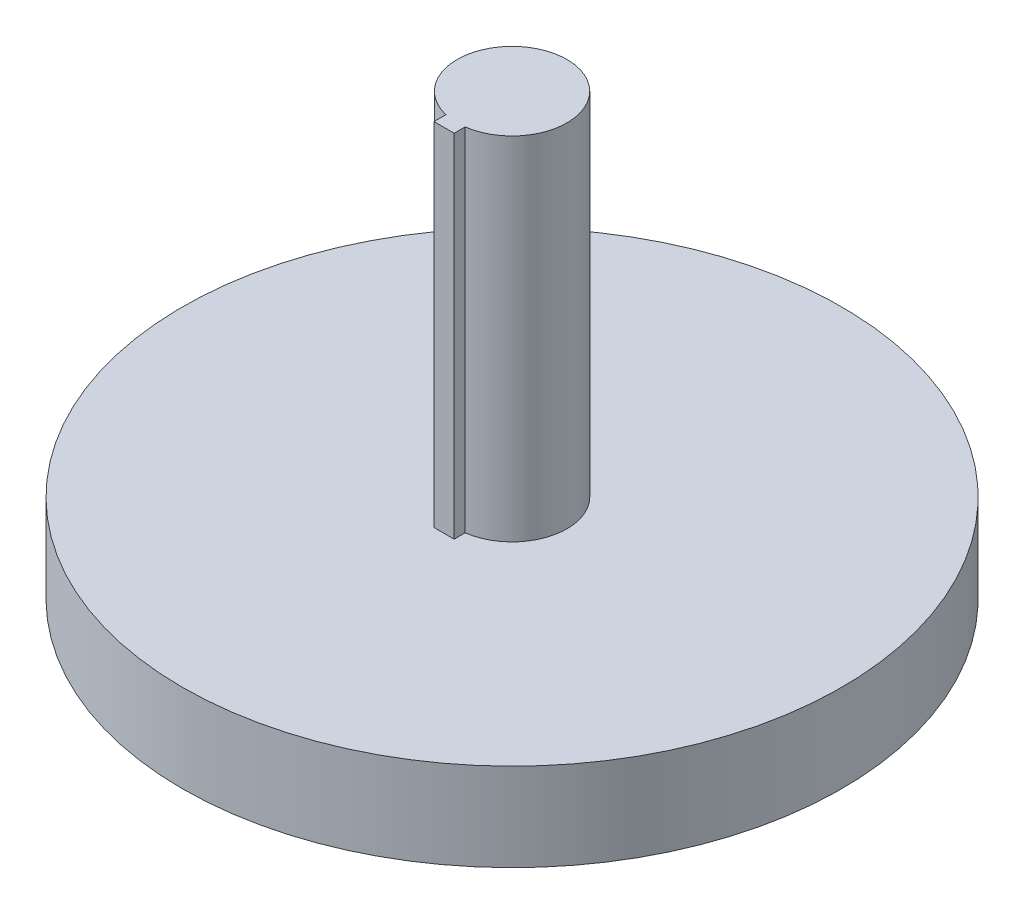
ISO-10303-21;
HEADER;
FILE_DESCRIPTION(('STEP AP214'),'2;1');
FILE_NAME('part.step','',(''),(''),'','','');
FILE_SCHEMA(('AUTOMOTIVE_DESIGN { 1 0 10303 214 1 1 1 1 }'));
ENDSEC;
DATA;
#1=APPLICATION_CONTEXT('core data for automotive mechanical design processes');
#2=APPLICATION_PROTOCOL_DEFINITION('international standard','automotive_design',2000,#1);
#3=PRODUCT_CONTEXT('',#1,'mechanical');
#4=PRODUCT('Part','Part','',(#3));
#5=PRODUCT_RELATED_PRODUCT_CATEGORY('part','',(#4));
#6=PRODUCT_DEFINITION_FORMATION('','',#4);
#7=PRODUCT_DEFINITION_CONTEXT('part definition',#1,'design');
#8=PRODUCT_DEFINITION('design','',#6,#7);
#9=PRODUCT_DEFINITION_SHAPE('','',#8);
#10=(LENGTH_UNIT() NAMED_UNIT(*) SI_UNIT(.MILLI.,.METRE.));
#11=(NAMED_UNIT(*) PLANE_ANGLE_UNIT() SI_UNIT($,.RADIAN.));
#12=(NAMED_UNIT(*) SI_UNIT($,.STERADIAN.) SOLID_ANGLE_UNIT());
#13=UNCERTAINTY_MEASURE_WITH_UNIT(LENGTH_MEASURE(1.E-05),#10,'distance_accuracy_value','');
#14=(GEOMETRIC_REPRESENTATION_CONTEXT(3) GLOBAL_UNCERTAINTY_ASSIGNED_CONTEXT((#13)) GLOBAL_UNIT_ASSIGNED_CONTEXT((#10,
#11,#12)) REPRESENTATION_CONTEXT('',''));
#15=CARTESIAN_POINT('',(0.,0.,0.));
#16=DIRECTION('',(0.,0.,1.));
#17=DIRECTION('',(1.,0.,0.));
#18=AXIS2_PLACEMENT_3D('',#15,#16,#17);
#19=CARTESIAN_POINT('',(0.,40.,0.));
#20=DIRECTION('',(0.,-1.,0.));
#21=DIRECTION('',(0.,0.,-1.));
#22=AXIS2_PLACEMENT_3D('',#19,#20,#21);
#23=CYLINDRICAL_SURFACE('',#22,150.);
#24=CARTESIAN_POINT('',(0.,40.,0.));
#25=DIRECTION('',(0.,1.,0.));
#26=DIRECTION('',(0.,0.,1.));
#27=AXIS2_PLACEMENT_3D('',#24,#25,#26);
#28=CIRCLE('',#27,150.);
#29=CARTESIAN_POINT('',(0.,40.,150.));
#30=VERTEX_POINT('',#29);
#31=EDGE_CURVE('E12',#30,#30,#28,.T.);
#32=ORIENTED_EDGE('',*,*,#31,.F.);
#33=EDGE_LOOP('',(#32));
#34=FACE_BOUND('',#33,.T.);
#35=CARTESIAN_POINT('',(0.,0.,0.));
#36=DIRECTION('',(0.,1.,0.));
#37=DIRECTION('',(0.,0.,1.));
#38=AXIS2_PLACEMENT_3D('',#35,#36,#37);
#39=CIRCLE('',#38,150.);
#40=CARTESIAN_POINT('',(0.,0.,150.));
#41=VERTEX_POINT('',#40);
#42=EDGE_CURVE('E72',#41,#41,#39,.T.);
#43=ORIENTED_EDGE('',*,*,#42,.T.);
#44=EDGE_LOOP('',(#43));
#45=FACE_BOUND('',#44,.T.);
#46=ADVANCED_FACE('F69',(#34,#45),#23,.T.);
#47=CARTESIAN_POINT('',(0.,40.,0.));
#48=DIRECTION('',(0.,1.,0.));
#49=DIRECTION('',(0.,0.,1.));
#50=AXIS2_PLACEMENT_3D('',#47,#48,#49);
#51=PLANE('',#50);
#52=CARTESIAN_POINT('',(0.,40.,0.));
#53=DIRECTION('',(0.,1.,0.));
#54=DIRECTION('',(0.,0.,1.));
#55=AXIS2_PLACEMENT_3D('',#52,#53,#54);
#56=CIRCLE('',#55,25.);
#57=CARTESIAN_POINT('',(3.40907157397966,40.,24.766473931577));
#58=VERTEX_POINT('',#57);
#59=CARTESIAN_POINT('',(-5.79092842602034,40.,24.3200564959194));
#60=VERTEX_POINT('',#59);
#61=EDGE_CURVE('E93',#58,#60,#56,.T.);
#62=ORIENTED_EDGE('',*,*,#61,.F.);
#63=DIRECTION('',(0.,0.,1.));
#64=VECTOR('',#63,1.);
#65=CARTESIAN_POINT('',(3.40907157397966,40.,0.));
#66=LINE('',#65,#64);
#67=CARTESIAN_POINT('',(3.40907157397966,40.,29.7600564959194));
#68=VERTEX_POINT('',#67);
#69=EDGE_CURVE('E115',#58,#68,#66,.T.);
#70=ORIENTED_EDGE('',*,*,#69,.T.);
#71=DIRECTION('',(1.,0.,0.));
#72=VECTOR('',#71,1.);
#73=CARTESIAN_POINT('',(0.,40.,29.7600564959194));
#74=LINE('',#73,#72);
#75=CARTESIAN_POINT('',(-5.79092842602034,40.,29.7600564959194));
#76=VERTEX_POINT('',#75);
#77=EDGE_CURVE('E150',#76,#68,#74,.T.);
#78=ORIENTED_EDGE('',*,*,#77,.F.);
#79=DIRECTION('',(0.,0.,1.));
#80=VECTOR('',#79,1.);
#81=CARTESIAN_POINT('',(-5.79092842602034,40.,0.));
#82=LINE('',#81,#80);
#83=EDGE_CURVE('E78',#60,#76,#82,.T.);
#84=ORIENTED_EDGE('',*,*,#83,.F.);
#85=EDGE_LOOP('',(#62,#70,#78,#84));
#86=FACE_BOUND('',#85,.T.);
#87=ORIENTED_EDGE('',*,*,#31,.T.);
#88=EDGE_LOOP('',(#87));
#89=FACE_BOUND('',#88,.T.);
#90=ADVANCED_FACE('F162',(#86,#89),#51,.T.);
#91=CARTESIAN_POINT('',(0.,0.,0.));
#92=DIRECTION('',(0.,1.,0.));
#93=DIRECTION('',(0.,0.,1.));
#94=AXIS2_PLACEMENT_3D('',#91,#92,#93);
#95=PLANE('',#94);
#96=ORIENTED_EDGE('',*,*,#42,.F.);
#97=EDGE_LOOP('',(#96));
#98=FACE_BOUND('',#97,.T.);
#99=ADVANCED_FACE('F165',(#98),#95,.F.);
#100=CARTESIAN_POINT('',(0.,200.,0.));
#101=DIRECTION('',(0.,-1.,0.));
#102=DIRECTION('',(0.,0.,-1.));
#103=AXIS2_PLACEMENT_3D('',#100,#101,#102);
#104=CYLINDRICAL_SURFACE('',#103,25.);
#105=ORIENTED_EDGE('',*,*,#61,.T.);
#106=DIRECTION('',(0.,-1.,0.));
#107=VECTOR('',#106,1.);
#108=CARTESIAN_POINT('',(-5.79092842602034,200.,24.3200564959194));
#109=LINE('',#108,#107);
#110=CARTESIAN_POINT('',(-5.79092842602034,200.,24.3200564959194));
#111=VERTEX_POINT('',#110);
#112=EDGE_CURVE('E118',#111,#60,#109,.T.);
#113=ORIENTED_EDGE('',*,*,#112,.F.);
#114=CARTESIAN_POINT('',(0.,200.,0.));
#115=DIRECTION('',(0.,1.,0.));
#116=DIRECTION('',(0.,0.,1.));
#117=AXIS2_PLACEMENT_3D('',#114,#115,#116);
#118=CIRCLE('',#117,25.);
#119=CARTESIAN_POINT('',(3.40907157397966,200.,24.766473931577));
#120=VERTEX_POINT('',#119);
#121=EDGE_CURVE('E123',#120,#111,#118,.T.);
#122=ORIENTED_EDGE('',*,*,#121,.F.);
#123=DIRECTION('',(0.,-1.,0.));
#124=VECTOR('',#123,1.);
#125=CARTESIAN_POINT('',(3.40907157397966,200.,24.766473931577));
#126=LINE('',#125,#124);
#127=EDGE_CURVE('E109',#120,#58,#126,.T.);
#128=ORIENTED_EDGE('',*,*,#127,.T.);
#129=EDGE_LOOP('',(#105,#113,#122,#128));
#130=FACE_BOUND('',#129,.T.);
#131=ADVANCED_FACE('F128',(#130),#104,.T.);
#132=CARTESIAN_POINT('',(0.,200.,0.));
#133=DIRECTION('',(0.,1.,0.));
#134=DIRECTION('',(0.,0.,1.));
#135=AXIS2_PLACEMENT_3D('',#132,#133,#134);
#136=PLANE('',#135);
#137=DIRECTION('',(0.,0.,1.));
#138=VECTOR('',#137,1.);
#139=CARTESIAN_POINT('',(3.40907157397966,200.,-2.00028789196171));
#140=LINE('',#139,#138);
#141=CARTESIAN_POINT('',(3.40907157397966,200.,29.7600564959194));
#142=VERTEX_POINT('',#141);
#143=EDGE_CURVE('E112',#120,#142,#140,.T.);
#144=ORIENTED_EDGE('',*,*,#143,.F.);
#145=ORIENTED_EDGE('',*,*,#121,.T.);
#146=DIRECTION('',(0.,0.,1.));
#147=VECTOR('',#146,1.);
#148=CARTESIAN_POINT('',(-5.79092842602034,200.,-2.00028789196171));
#149=LINE('',#148,#147);
#150=CARTESIAN_POINT('',(-5.79092842602034,200.,29.7600564959194));
#151=VERTEX_POINT('',#150);
#152=EDGE_CURVE('E139',#111,#151,#149,.T.);
#153=ORIENTED_EDGE('',*,*,#152,.T.);
#154=DIRECTION('',(1.,0.,0.));
#155=VECTOR('',#154,1.);
#156=CARTESIAN_POINT('',(-5.79092842602034,200.,29.7600564959194));
#157=LINE('',#156,#155);
#158=EDGE_CURVE('E125',#151,#142,#157,.T.);
#159=ORIENTED_EDGE('',*,*,#158,.T.);
#160=EDGE_LOOP('',(#144,#145,#153,#159));
#161=FACE_BOUND('',#160,.T.);
#162=ADVANCED_FACE('F122',(#161),#136,.T.);
#163=CARTESIAN_POINT('',(-5.79092842602034,200.,-2.00028789196171));
#164=DIRECTION('',(1.,0.,0.));
#165=DIRECTION('',(0.,0.,-1.));
#166=AXIS2_PLACEMENT_3D('',#163,#164,#165);
#167=PLANE('',#166);
#168=ORIENTED_EDGE('',*,*,#83,.T.);
#169=DIRECTION('',(0.,-1.,0.));
#170=VECTOR('',#169,1.);
#171=CARTESIAN_POINT('',(-5.79092842602034,200.,29.7600564959194));
#172=LINE('',#171,#170);
#173=EDGE_CURVE('E131',#151,#76,#172,.T.);
#174=ORIENTED_EDGE('',*,*,#173,.F.);
#175=ORIENTED_EDGE('',*,*,#152,.F.);
#176=ORIENTED_EDGE('',*,*,#112,.T.);
#177=EDGE_LOOP('',(#168,#174,#175,#176));
#178=FACE_BOUND('',#177,.T.);
#179=ADVANCED_FACE('F157',(#178),#167,.F.);
#180=CARTESIAN_POINT('',(-5.79092842602034,200.,29.7600564959194));
#181=DIRECTION('',(0.,0.,-1.));
#182=DIRECTION('',(-1.,0.,0.));
#183=AXIS2_PLACEMENT_3D('',#180,#181,#182);
#184=PLANE('',#183);
#185=ORIENTED_EDGE('',*,*,#77,.T.);
#186=DIRECTION('',(0.,-1.,0.));
#187=VECTOR('',#186,1.);
#188=CARTESIAN_POINT('',(3.40907157397966,200.,29.7600564959194));
#189=LINE('',#188,#187);
#190=EDGE_CURVE('E85',#142,#68,#189,.T.);
#191=ORIENTED_EDGE('',*,*,#190,.F.);
#192=ORIENTED_EDGE('',*,*,#158,.F.);
#193=ORIENTED_EDGE('',*,*,#173,.T.);
#194=EDGE_LOOP('',(#185,#191,#192,#193));
#195=FACE_BOUND('',#194,.T.);
#196=ADVANCED_FACE('F161',(#195),#184,.F.);
#197=CARTESIAN_POINT('',(3.40907157397966,200.,-2.00028789196171));
#198=DIRECTION('',(1.,0.,0.));
#199=DIRECTION('',(0.,0.,-1.));
#200=AXIS2_PLACEMENT_3D('',#197,#198,#199);
#201=PLANE('',#200);
#202=ORIENTED_EDGE('',*,*,#190,.T.);
#203=ORIENTED_EDGE('',*,*,#69,.F.);
#204=ORIENTED_EDGE('',*,*,#127,.F.);
#205=ORIENTED_EDGE('',*,*,#143,.T.);
#206=EDGE_LOOP('',(#202,#203,#204,#205));
#207=FACE_BOUND('',#206,.T.);
#208=ADVANCED_FACE('F111',(#207),#201,.T.);
#209=CLOSED_SHELL('',(#46,#90,#99,#131,#162,#179,#196,#208));
#210=MANIFOLD_SOLID_BREP('B2',#209);
#211=ADVANCED_BREP_SHAPE_REPRESENTATION('',(#18,#210),#14);
#212=SHAPE_DEFINITION_REPRESENTATION(#9,#211);
ENDSEC;
END-ISO-10303-21;
